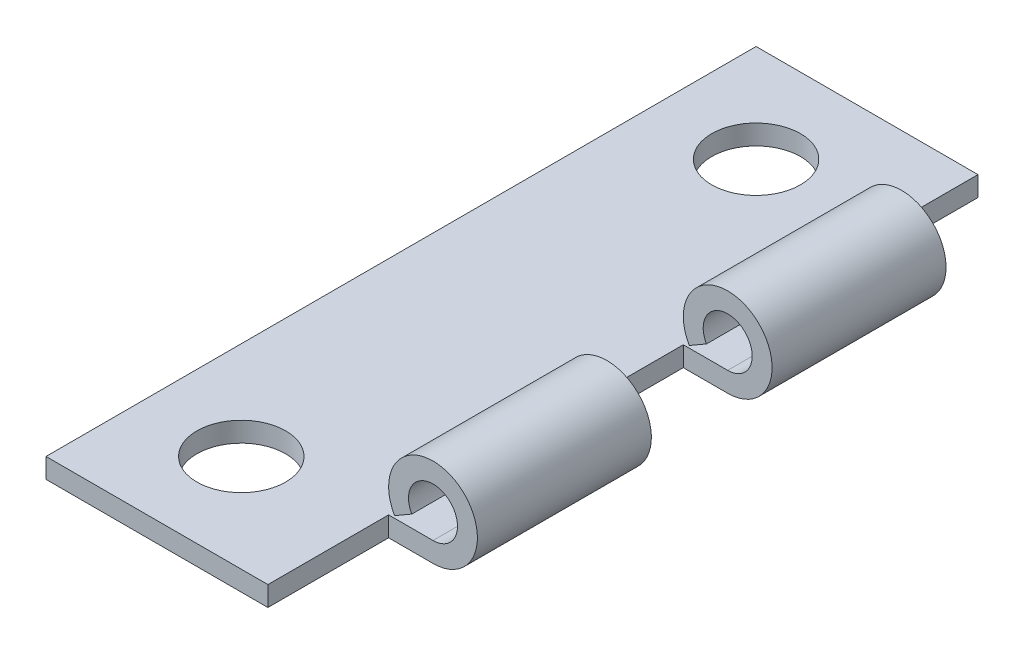
ISO-10303-21;
HEADER;
FILE_DESCRIPTION(('STEP AP214'),'2;1');
FILE_NAME('part.step','',(''),(''),'','','');
FILE_SCHEMA(('AUTOMOTIVE_DESIGN { 1 0 10303 214 1 1 1 1 }'));
ENDSEC;
DATA;
#1=APPLICATION_CONTEXT('core data for automotive mechanical design processes');
#2=APPLICATION_PROTOCOL_DEFINITION('international standard','automotive_design',2000,#1);
#3=PRODUCT_CONTEXT('',#1,'mechanical');
#4=PRODUCT('Part','Part','',(#3));
#5=PRODUCT_RELATED_PRODUCT_CATEGORY('part','',(#4));
#6=PRODUCT_DEFINITION_FORMATION('','',#4);
#7=PRODUCT_DEFINITION_CONTEXT('part definition',#1,'design');
#8=PRODUCT_DEFINITION('design','',#6,#7);
#9=PRODUCT_DEFINITION_SHAPE('','',#8);
#10=(LENGTH_UNIT() NAMED_UNIT(*) SI_UNIT(.MILLI.,.METRE.));
#11=(NAMED_UNIT(*) PLANE_ANGLE_UNIT() SI_UNIT($,.RADIAN.));
#12=(NAMED_UNIT(*) SI_UNIT($,.STERADIAN.) SOLID_ANGLE_UNIT());
#13=UNCERTAINTY_MEASURE_WITH_UNIT(LENGTH_MEASURE(1.E-05),#10,'distance_accuracy_value','');
#14=(GEOMETRIC_REPRESENTATION_CONTEXT(3) GLOBAL_UNCERTAINTY_ASSIGNED_CONTEXT((#13)) GLOBAL_UNIT_ASSIGNED_CONTEXT((#10,
#11,#12)) REPRESENTATION_CONTEXT('',''));
#15=CARTESIAN_POINT('',(0.,0.,0.));
#16=DIRECTION('',(0.,0.,1.));
#17=DIRECTION('',(1.,0.,0.));
#18=AXIS2_PLACEMENT_3D('',#15,#16,#17);
#19=CARTESIAN_POINT('',(19.05,3.175,50.8));
#20=DIRECTION('',(0.,0.,-1.));
#21=DIRECTION('',(-1.,0.,0.));
#22=AXIS2_PLACEMENT_3D('',#19,#20,#21);
#23=CYLINDRICAL_SURFACE('',#22,3.175);
#24=CARTESIAN_POINT('',(19.05,3.175,8.636));
#25=DIRECTION('',(0.,0.,1.));
#26=DIRECTION('',(1.,0.,0.));
#27=AXIS2_PLACEMENT_3D('',#24,#25,#26);
#28=CIRCLE('',#27,3.175);
#29=CARTESIAN_POINT('',(19.05,0.,8.636));
#30=VERTEX_POINT('',#29);
#31=CARTESIAN_POINT('',(16.3003693429844,1.58750000000001,8.636));
#32=VERTEX_POINT('',#31);
#33=EDGE_CURVE('E159',#30,#32,#28,.T.);
#34=ORIENTED_EDGE('',*,*,#33,.T.);
#35=DIRECTION('',(0.,0.,-1.));
#36=VECTOR('',#35,1.);
#37=CARTESIAN_POINT('',(16.3003693429844,1.5875,50.8));
#38=LINE('',#37,#36);
#39=CARTESIAN_POINT('',(16.3003693429844,1.5875,21.082));
#40=VERTEX_POINT('',#39);
#41=EDGE_CURVE('E257',#40,#32,#38,.T.);
#42=ORIENTED_EDGE('',*,*,#41,.F.);
#43=CARTESIAN_POINT('',(19.05,3.175,21.082));
#44=DIRECTION('',(0.,0.,-1.));
#45=DIRECTION('',(-1.,0.,0.));
#46=AXIS2_PLACEMENT_3D('',#43,#44,#45);
#47=CIRCLE('',#46,3.175);
#48=CARTESIAN_POINT('',(19.05,0.,21.082));
#49=VERTEX_POINT('',#48);
#50=EDGE_CURVE('E203',#40,#49,#47,.T.);
#51=ORIENTED_EDGE('',*,*,#50,.T.);
#52=DIRECTION('',(0.,0.,-1.));
#53=VECTOR('',#52,1.);
#54=CARTESIAN_POINT('',(19.05,0.,50.8));
#55=LINE('',#54,#53);
#56=EDGE_CURVE('E261',#49,#30,#55,.T.);
#57=ORIENTED_EDGE('',*,*,#56,.T.);
#58=EDGE_LOOP('',(#34,#42,#51,#57));
#59=FACE_BOUND('',#58,.T.);
#60=ADVANCED_FACE('F37',(#59),#23,.T.);
#61=CARTESIAN_POINT('',(16.3003693429844,1.5875,50.8));
#62=DIRECTION('',(-0.499999999999978,0.866025403784451,0.));
#63=DIRECTION('',(-0.866025403784451,-0.499999999999978,0.));
#64=AXIS2_PLACEMENT_3D('',#61,#62,#63);
#65=PLANE('',#64);
#66=ORIENTED_EDGE('',*,*,#41,.T.);
#67=DIRECTION('',(0.866025403784451,0.499999999999978,0.));
#68=VECTOR('',#67,1.);
#69=CARTESIAN_POINT('',(16.3003693429844,1.58750000000001,8.636));
#70=LINE('',#69,#68);
#71=CARTESIAN_POINT('',(17.5322038773275,2.2987,8.636));
#72=VERTEX_POINT('',#71);
#73=EDGE_CURVE('E174',#32,#72,#70,.T.);
#74=ORIENTED_EDGE('',*,*,#73,.T.);
#75=DIRECTION('',(0.,0.,-1.));
#76=VECTOR('',#75,1.);
#77=CARTESIAN_POINT('',(17.5322038773275,2.2987,50.8));
#78=LINE('',#77,#76);
#79=CARTESIAN_POINT('',(17.5322038773275,2.2987,21.082));
#80=VERTEX_POINT('',#79);
#81=EDGE_CURVE('E253',#80,#72,#78,.T.);
#82=ORIENTED_EDGE('',*,*,#81,.F.);
#83=DIRECTION('',(-0.866025403784451,-0.499999999999978,0.));
#84=VECTOR('',#83,1.);
#85=CARTESIAN_POINT('',(16.3003693429844,1.58750000000001,21.082));
#86=LINE('',#85,#84);
#87=EDGE_CURVE('E200',#80,#40,#86,.T.);
#88=ORIENTED_EDGE('',*,*,#87,.T.);
#89=EDGE_LOOP('',(#66,#74,#82,#88));
#90=FACE_BOUND('',#89,.T.);
#91=ADVANCED_FACE('F299',(#90),#65,.F.);
#92=CARTESIAN_POINT('',(19.0500000000001,3.175,50.8));
#93=DIRECTION('',(0.,0.,-1.));
#94=DIRECTION('',(-1.,0.,0.));
#95=AXIS2_PLACEMENT_3D('',#92,#93,#94);
#96=CYLINDRICAL_SURFACE('',#95,1.7526);
#97=ORIENTED_EDGE('',*,*,#81,.T.);
#98=CARTESIAN_POINT('',(19.0500000000001,3.175,8.636));
#99=DIRECTION('',(0.,0.,1.));
#100=DIRECTION('',(1.,0.,0.));
#101=AXIS2_PLACEMENT_3D('',#98,#99,#100);
#102=CIRCLE('',#101,1.7526);
#103=CARTESIAN_POINT('',(19.0500000000001,1.4224,8.636));
#104=VERTEX_POINT('',#103);
#105=EDGE_CURVE('E171',#72,#104,#102,.F.);
#106=ORIENTED_EDGE('',*,*,#105,.T.);
#107=DIRECTION('',(0.,0.,-1.));
#108=VECTOR('',#107,1.);
#109=CARTESIAN_POINT('',(19.0500000000001,1.4224,50.8));
#110=LINE('',#109,#108);
#111=CARTESIAN_POINT('',(19.0500000000001,1.4224,21.082));
#112=VERTEX_POINT('',#111);
#113=EDGE_CURVE('E249',#112,#104,#110,.T.);
#114=ORIENTED_EDGE('',*,*,#113,.F.);
#115=CARTESIAN_POINT('',(19.0500000000001,3.175,21.082));
#116=DIRECTION('',(0.,0.,-1.));
#117=DIRECTION('',(-1.,0.,0.));
#118=AXIS2_PLACEMENT_3D('',#115,#116,#117);
#119=CIRCLE('',#118,1.7526);
#120=EDGE_CURVE('E197',#112,#80,#119,.F.);
#121=ORIENTED_EDGE('',*,*,#120,.T.);
#122=EDGE_LOOP('',(#97,#106,#114,#121));
#123=FACE_BOUND('',#122,.T.);
#124=ADVANCED_FACE('F295',(#123),#96,.F.);
#125=CARTESIAN_POINT('',(19.05,3.175,29.718));
#126=DIRECTION('',(0.,0.,1.));
#127=DIRECTION('',(1.,0.,0.));
#128=AXIS2_PLACEMENT_3D('',#125,#126,#127);
#129=CIRCLE('',#128,3.175);
#130=CARTESIAN_POINT('',(19.05,0.,29.718));
#131=VERTEX_POINT('',#130);
#132=CARTESIAN_POINT('',(16.3003693429844,1.5875,29.718));
#133=VERTEX_POINT('',#132);
#134=EDGE_CURVE('E195',#131,#133,#129,.T.);
#135=ORIENTED_EDGE('',*,*,#134,.T.);
#136=CARTESIAN_POINT('',(16.3003693429844,1.5875,42.164));
#137=VERTEX_POINT('',#136);
#138=EDGE_CURVE('E258',#137,#133,#38,.T.);
#139=ORIENTED_EDGE('',*,*,#138,.F.);
#140=CARTESIAN_POINT('',(19.05,3.175,42.164));
#141=DIRECTION('',(0.,0.,-1.));
#142=DIRECTION('',(-1.,0.,0.));
#143=AXIS2_PLACEMENT_3D('',#140,#141,#142);
#144=CIRCLE('',#143,3.175);
#145=CARTESIAN_POINT('',(19.05,0.,42.164));
#146=VERTEX_POINT('',#145);
#147=EDGE_CURVE('E222',#137,#146,#144,.T.);
#148=ORIENTED_EDGE('',*,*,#147,.T.);
#149=EDGE_CURVE('E262',#146,#131,#55,.T.);
#150=ORIENTED_EDGE('',*,*,#149,.T.);
#151=EDGE_LOOP('',(#135,#139,#148,#150));
#152=FACE_BOUND('',#151,.T.);
#153=ADVANCED_FACE('F315',(#152),#23,.T.);
#154=CARTESIAN_POINT('',(0.,1.42239999999999,50.8));
#155=DIRECTION('',(1.,0.,0.));
#156=DIRECTION('',(0.,1.,0.));
#157=AXIS2_PLACEMENT_3D('',#154,#155,#156);
#158=PLANE('',#157);
#159=DIRECTION('',(0.,-1.,0.));
#160=VECTOR('',#159,1.);
#161=CARTESIAN_POINT('',(0.,1.42239999999999,0.));
#162=LINE('',#161,#160);
#163=CARTESIAN_POINT('',(0.,1.42239999999999,0.));
#164=VERTEX_POINT('',#163);
#165=CARTESIAN_POINT('',(0.,0.,0.));
#166=VERTEX_POINT('',#165);
#167=EDGE_CURVE('E242',#164,#166,#162,.T.);
#168=ORIENTED_EDGE('',*,*,#167,.T.);
#169=DIRECTION('',(0.,0.,-1.));
#170=VECTOR('',#169,1.);
#171=CARTESIAN_POINT('',(0.,0.,50.8));
#172=LINE('',#171,#170);
#173=CARTESIAN_POINT('',(0.,0.,50.8));
#174=VERTEX_POINT('',#173);
#175=EDGE_CURVE('E265',#174,#166,#172,.T.);
#176=ORIENTED_EDGE('',*,*,#175,.F.);
#177=DIRECTION('',(0.,-1.,0.));
#178=VECTOR('',#177,1.);
#179=CARTESIAN_POINT('',(0.,1.42239999999999,50.8));
#180=LINE('',#179,#178);
#181=CARTESIAN_POINT('',(0.,1.42239999999999,50.8));
#182=VERTEX_POINT('',#181);
#183=EDGE_CURVE('E232',#182,#174,#180,.T.);
#184=ORIENTED_EDGE('',*,*,#183,.F.);
#185=DIRECTION('',(0.,0.,-1.));
#186=VECTOR('',#185,1.);
#187=CARTESIAN_POINT('',(0.,1.42239999999999,50.8));
#188=LINE('',#187,#186);
#189=EDGE_CURVE('E241',#182,#164,#188,.T.);
#190=ORIENTED_EDGE('',*,*,#189,.T.);
#191=EDGE_LOOP('',(#168,#176,#184,#190));
#192=FACE_BOUND('',#191,.T.);
#193=ADVANCED_FACE('F39',(#192),#158,.F.);
#194=CARTESIAN_POINT('',(0.,0.,50.8));
#195=DIRECTION('',(0.,1.,0.));
#196=DIRECTION('',(0.,0.,1.));
#197=AXIS2_PLACEMENT_3D('',#194,#195,#196);
#198=PLANE('',#197);
#199=CARTESIAN_POINT('',(6.985,0.,6.985));
#200=DIRECTION('',(0.,-1.,0.));
#201=DIRECTION('',(0.,0.,-1.));
#202=AXIS2_PLACEMENT_3D('',#199,#200,#201);
#203=CIRCLE('',#202,3.175);
#204=CARTESIAN_POINT('',(6.985,0.,3.81));
#205=VERTEX_POINT('',#204);
#206=EDGE_CURVE('E224',#205,#205,#203,.T.);
#207=ORIENTED_EDGE('',*,*,#206,.F.);
#208=EDGE_LOOP('',(#207));
#209=FACE_BOUND('',#208,.T.);
#210=CARTESIAN_POINT('',(6.985,0.,43.815));
#211=DIRECTION('',(0.,-1.,0.));
#212=DIRECTION('',(0.,0.,-1.));
#213=AXIS2_PLACEMENT_3D('',#210,#211,#212);
#214=CIRCLE('',#213,3.175);
#215=CARTESIAN_POINT('',(6.985,0.,40.64));
#216=VERTEX_POINT('',#215);
#217=EDGE_CURVE('E228',#216,#216,#214,.T.);
#218=ORIENTED_EDGE('',*,*,#217,.F.);
#219=EDGE_LOOP('',(#218));
#220=FACE_BOUND('',#219,.T.);
#221=DIRECTION('',(1.,0.,0.));
#222=VECTOR('',#221,1.);
#223=CARTESIAN_POINT('',(0.,0.,0.));
#224=LINE('',#223,#222);
#225=CARTESIAN_POINT('',(15.875,0.,0.));
#226=VERTEX_POINT('',#225);
#227=EDGE_CURVE('E167',#166,#226,#224,.T.);
#228=ORIENTED_EDGE('',*,*,#227,.T.);
#229=DIRECTION('',(0.,0.,-1.));
#230=VECTOR('',#229,1.);
#231=CARTESIAN_POINT('',(15.875,0.,8.636));
#232=LINE('',#231,#230);
#233=CARTESIAN_POINT('',(15.875,0.,8.636));
#234=VERTEX_POINT('',#233);
#235=EDGE_CURVE('E52',#234,#226,#232,.T.);
#236=ORIENTED_EDGE('',*,*,#235,.F.);
#237=DIRECTION('',(-1.,0.,0.));
#238=VECTOR('',#237,1.);
#239=CARTESIAN_POINT('',(22.225,0.,8.636));
#240=LINE('',#239,#238);
#241=EDGE_CURVE('E156',#30,#234,#240,.T.);
#242=ORIENTED_EDGE('',*,*,#241,.F.);
#243=ORIENTED_EDGE('',*,*,#56,.F.);
#244=DIRECTION('',(1.,0.,0.));
#245=VECTOR('',#244,1.);
#246=CARTESIAN_POINT('',(22.225,0.,21.082));
#247=LINE('',#246,#245);
#248=CARTESIAN_POINT('',(15.875,0.,21.082));
#249=VERTEX_POINT('',#248);
#250=EDGE_CURVE('E183',#249,#49,#247,.T.);
#251=ORIENTED_EDGE('',*,*,#250,.F.);
#252=DIRECTION('',(0.,0.,-1.));
#253=VECTOR('',#252,1.);
#254=CARTESIAN_POINT('',(15.875,0.,29.718));
#255=LINE('',#254,#253);
#256=CARTESIAN_POINT('',(15.875,0.,29.718));
#257=VERTEX_POINT('',#256);
#258=EDGE_CURVE('E180',#257,#249,#255,.T.);
#259=ORIENTED_EDGE('',*,*,#258,.F.);
#260=DIRECTION('',(-1.,0.,0.));
#261=VECTOR('',#260,1.);
#262=CARTESIAN_POINT('',(22.225,0.,29.718));
#263=LINE('',#262,#261);
#264=EDGE_CURVE('E178',#131,#257,#263,.T.);
#265=ORIENTED_EDGE('',*,*,#264,.F.);
#266=ORIENTED_EDGE('',*,*,#149,.F.);
#267=DIRECTION('',(1.,0.,0.));
#268=VECTOR('',#267,1.);
#269=CARTESIAN_POINT('',(15.875,0.,42.164));
#270=LINE('',#269,#268);
#271=CARTESIAN_POINT('',(15.875,0.,42.164));
#272=VERTEX_POINT('',#271);
#273=EDGE_CURVE('E208',#272,#146,#270,.T.);
#274=ORIENTED_EDGE('',*,*,#273,.F.);
#275=DIRECTION('',(0.,0.,-1.));
#276=VECTOR('',#275,1.);
#277=CARTESIAN_POINT('',(15.875,0.,50.8));
#278=LINE('',#277,#276);
#279=CARTESIAN_POINT('',(15.875,0.,50.8));
#280=VERTEX_POINT('',#279);
#281=EDGE_CURVE('E205',#280,#272,#278,.T.);
#282=ORIENTED_EDGE('',*,*,#281,.F.);
#283=DIRECTION('',(1.,0.,0.));
#284=VECTOR('',#283,1.);
#285=CARTESIAN_POINT('',(0.,0.,50.8));
#286=LINE('',#285,#284);
#287=EDGE_CURVE('E235',#174,#280,#286,.T.);
#288=ORIENTED_EDGE('',*,*,#287,.F.);
#289=ORIENTED_EDGE('',*,*,#175,.T.);
#290=EDGE_LOOP('',(#228,#236,#242,#243,#251,#259,#265,#266,#274,#282,#288,#289));
#291=FACE_BOUND('',#290,.T.);
#292=ADVANCED_FACE('F165',(#209,#220,#291),#198,.F.);
#293=ORIENTED_EDGE('',*,*,#138,.T.);
#294=DIRECTION('',(0.866025403784451,0.499999999999978,0.));
#295=VECTOR('',#294,1.);
#296=CARTESIAN_POINT('',(16.3003693429844,1.5875,29.718));
#297=LINE('',#296,#295);
#298=CARTESIAN_POINT('',(17.5322038773275,2.2987,29.718));
#299=VERTEX_POINT('',#298);
#300=EDGE_CURVE('E192',#133,#299,#297,.T.);
#301=ORIENTED_EDGE('',*,*,#300,.T.);
#302=CARTESIAN_POINT('',(17.5322038773275,2.2987,42.164));
#303=VERTEX_POINT('',#302);
#304=EDGE_CURVE('E254',#303,#299,#78,.T.);
#305=ORIENTED_EDGE('',*,*,#304,.F.);
#306=DIRECTION('',(-0.866025403784451,-0.499999999999978,0.));
#307=VECTOR('',#306,1.);
#308=CARTESIAN_POINT('',(16.3003693429844,1.5875,42.164));
#309=LINE('',#308,#307);
#310=EDGE_CURVE('E219',#303,#137,#309,.T.);
#311=ORIENTED_EDGE('',*,*,#310,.T.);
#312=EDGE_LOOP('',(#293,#301,#305,#311));
#313=FACE_BOUND('',#312,.T.);
#314=ADVANCED_FACE('F347',(#313),#65,.F.);
#315=ORIENTED_EDGE('',*,*,#304,.T.);
#316=CARTESIAN_POINT('',(19.0500000000001,3.175,29.718));
#317=DIRECTION('',(0.,0.,1.));
#318=DIRECTION('',(1.,0.,0.));
#319=AXIS2_PLACEMENT_3D('',#316,#317,#318);
#320=CIRCLE('',#319,1.7526);
#321=CARTESIAN_POINT('',(19.0500000000001,1.4224,29.718));
#322=VERTEX_POINT('',#321);
#323=EDGE_CURVE('E188',#299,#322,#320,.F.);
#324=ORIENTED_EDGE('',*,*,#323,.T.);
#325=CARTESIAN_POINT('',(19.0500000000001,1.4224,42.164));
#326=VERTEX_POINT('',#325);
#327=EDGE_CURVE('E250',#326,#322,#110,.T.);
#328=ORIENTED_EDGE('',*,*,#327,.F.);
#329=CARTESIAN_POINT('',(19.0500000000001,3.175,42.164));
#330=DIRECTION('',(0.,0.,-1.));
#331=DIRECTION('',(-1.,0.,0.));
#332=AXIS2_PLACEMENT_3D('',#329,#330,#331);
#333=CIRCLE('',#332,1.7526);
#334=EDGE_CURVE('E216',#326,#303,#333,.F.);
#335=ORIENTED_EDGE('',*,*,#334,.T.);
#336=EDGE_LOOP('',(#315,#324,#328,#335));
#337=FACE_BOUND('',#336,.T.);
#338=ADVANCED_FACE('F354',(#337),#96,.F.);
#339=CARTESIAN_POINT('',(19.0500000000001,1.4224,50.8));
#340=DIRECTION('',(0.,-1.,0.));
#341=DIRECTION('',(1.,0.,0.));
#342=AXIS2_PLACEMENT_3D('',#339,#340,#341);
#343=PLANE('',#342);
#344=CARTESIAN_POINT('',(6.985,1.42239999999999,6.985));
#345=DIRECTION('',(0.,-1.,0.));
#346=DIRECTION('',(1.,0.,0.));
#347=AXIS2_PLACEMENT_3D('',#344,#345,#346);
#348=CIRCLE('',#347,3.175);
#349=CARTESIAN_POINT('',(10.16,1.4224,6.985));
#350=VERTEX_POINT('',#349);
#351=EDGE_CURVE('E227',#350,#350,#348,.T.);
#352=ORIENTED_EDGE('',*,*,#351,.T.);
#353=EDGE_LOOP('',(#352));
#354=FACE_BOUND('',#353,.T.);
#355=CARTESIAN_POINT('',(6.985,1.42239999999999,43.815));
#356=DIRECTION('',(0.,-1.,0.));
#357=DIRECTION('',(1.,0.,0.));
#358=AXIS2_PLACEMENT_3D('',#355,#356,#357);
#359=CIRCLE('',#358,3.175);
#360=CARTESIAN_POINT('',(10.16,1.4224,43.815));
#361=VERTEX_POINT('',#360);
#362=EDGE_CURVE('E231',#361,#361,#359,.T.);
#363=ORIENTED_EDGE('',*,*,#362,.T.);
#364=EDGE_LOOP('',(#363));
#365=FACE_BOUND('',#364,.T.);
#366=DIRECTION('',(-1.,0.,0.));
#367=VECTOR('',#366,1.);
#368=CARTESIAN_POINT('',(19.0500000000001,1.4224,8.636));
#369=LINE('',#368,#367);
#370=CARTESIAN_POINT('',(15.875,1.4224,8.636));
#371=VERTEX_POINT('',#370);
#372=EDGE_CURVE('E11',#104,#371,#369,.T.);
#373=ORIENTED_EDGE('',*,*,#372,.T.);
#374=DIRECTION('',(0.,0.,-1.));
#375=VECTOR('',#374,1.);
#376=CARTESIAN_POINT('',(15.875,1.4224,50.8));
#377=LINE('',#376,#375);
#378=CARTESIAN_POINT('',(15.875,1.4224,0.));
#379=VERTEX_POINT('',#378);
#380=EDGE_CURVE('E152',#371,#379,#377,.T.);
#381=ORIENTED_EDGE('',*,*,#380,.T.);
#382=DIRECTION('',(-1.,0.,0.));
#383=VECTOR('',#382,1.);
#384=CARTESIAN_POINT('',(19.0500000000001,1.4224,0.));
#385=LINE('',#384,#383);
#386=EDGE_CURVE('E236',#379,#164,#385,.T.);
#387=ORIENTED_EDGE('',*,*,#386,.T.);
#388=ORIENTED_EDGE('',*,*,#189,.F.);
#389=DIRECTION('',(-1.,0.,0.));
#390=VECTOR('',#389,1.);
#391=CARTESIAN_POINT('',(19.0500000000001,1.4224,50.8));
#392=LINE('',#391,#390);
#393=CARTESIAN_POINT('',(15.875,1.4224,50.8));
#394=VERTEX_POINT('',#393);
#395=EDGE_CURVE('E239',#394,#182,#392,.T.);
#396=ORIENTED_EDGE('',*,*,#395,.F.);
#397=DIRECTION('',(0.,0.,-1.));
#398=VECTOR('',#397,1.);
#399=CARTESIAN_POINT('',(15.875,1.4224,50.8));
#400=LINE('',#399,#398);
#401=CARTESIAN_POINT('',(15.875,1.4224,42.164));
#402=VERTEX_POINT('',#401);
#403=EDGE_CURVE('E213',#394,#402,#400,.T.);
#404=ORIENTED_EDGE('',*,*,#403,.T.);
#405=DIRECTION('',(1.,0.,0.));
#406=VECTOR('',#405,1.);
#407=CARTESIAN_POINT('',(19.0500000000001,1.4224,42.164));
#408=LINE('',#407,#406);
#409=EDGE_CURVE('E273',#402,#326,#408,.T.);
#410=ORIENTED_EDGE('',*,*,#409,.T.);
#411=ORIENTED_EDGE('',*,*,#327,.T.);
#412=DIRECTION('',(-1.,0.,0.));
#413=VECTOR('',#412,1.);
#414=CARTESIAN_POINT('',(19.0500000000001,1.4224,29.718));
#415=LINE('',#414,#413);
#416=CARTESIAN_POINT('',(15.875,1.4224,29.718));
#417=VERTEX_POINT('',#416);
#418=EDGE_CURVE('E276',#322,#417,#415,.T.);
#419=ORIENTED_EDGE('',*,*,#418,.T.);
#420=DIRECTION('',(0.,0.,-1.));
#421=VECTOR('',#420,1.);
#422=CARTESIAN_POINT('',(15.875,1.4224,50.8));
#423=LINE('',#422,#421);
#424=CARTESIAN_POINT('',(15.875,1.42239999999999,21.082));
#425=VERTEX_POINT('',#424);
#426=EDGE_CURVE('E279',#417,#425,#423,.T.);
#427=ORIENTED_EDGE('',*,*,#426,.T.);
#428=DIRECTION('',(1.,0.,0.));
#429=VECTOR('',#428,1.);
#430=CARTESIAN_POINT('',(19.0500000000001,1.4224,21.082));
#431=LINE('',#430,#429);
#432=EDGE_CURVE('E282',#425,#112,#431,.T.);
#433=ORIENTED_EDGE('',*,*,#432,.T.);
#434=ORIENTED_EDGE('',*,*,#113,.T.);
#435=EDGE_LOOP('',(#373,#381,#387,#388,#396,#404,#410,#411,#419,#427,#433,#434));
#436=FACE_BOUND('',#435,.T.);
#437=ADVANCED_FACE('F289',(#354,#365,#436),#343,.F.);
#438=CARTESIAN_POINT('',(19.05,3.175,50.8));
#439=DIRECTION('',(0.,0.,1.));
#440=DIRECTION('',(1.,0.,0.));
#441=AXIS2_PLACEMENT_3D('',#438,#439,#440);
#442=PLANE('',#441);
#443=DIRECTION('',(0.,-1.,0.));
#444=VECTOR('',#443,1.);
#445=CARTESIAN_POINT('',(15.875,3.175,50.8));
#446=LINE('',#445,#444);
#447=EDGE_CURVE('E267',#394,#280,#446,.T.);
#448=ORIENTED_EDGE('',*,*,#447,.F.);
#449=ORIENTED_EDGE('',*,*,#395,.T.);
#450=ORIENTED_EDGE('',*,*,#183,.T.);
#451=ORIENTED_EDGE('',*,*,#287,.T.);
#452=EDGE_LOOP('',(#448,#449,#450,#451));
#453=FACE_BOUND('',#452,.T.);
#454=ADVANCED_FACE('F324',(#453),#442,.T.);
#455=CARTESIAN_POINT('',(19.05,3.175,0.));
#456=DIRECTION('',(0.,0.,1.));
#457=DIRECTION('',(1.,0.,0.));
#458=AXIS2_PLACEMENT_3D('',#455,#456,#457);
#459=PLANE('',#458);
#460=ORIENTED_EDGE('',*,*,#386,.F.);
#461=DIRECTION('',(0.,-1.,0.));
#462=VECTOR('',#461,1.);
#463=CARTESIAN_POINT('',(15.875,3.175,0.));
#464=LINE('',#463,#462);
#465=EDGE_CURVE('E45',#379,#226,#464,.T.);
#466=ORIENTED_EDGE('',*,*,#465,.T.);
#467=ORIENTED_EDGE('',*,*,#227,.F.);
#468=ORIENTED_EDGE('',*,*,#167,.F.);
#469=EDGE_LOOP('',(#460,#466,#467,#468));
#470=FACE_BOUND('',#469,.T.);
#471=ADVANCED_FACE('F286',(#470),#459,.F.);
#472=CARTESIAN_POINT('',(6.985,6.35,43.815));
#473=DIRECTION('',(0.,-1.,0.));
#474=DIRECTION('',(0.,0.,-1.));
#475=AXIS2_PLACEMENT_3D('',#472,#473,#474);
#476=CYLINDRICAL_SURFACE('',#475,3.175);
#477=ORIENTED_EDGE('',*,*,#217,.T.);
#478=EDGE_LOOP('',(#477));
#479=FACE_BOUND('',#478,.T.);
#480=ORIENTED_EDGE('',*,*,#362,.F.);
#481=EDGE_LOOP('',(#480));
#482=FACE_BOUND('',#481,.T.);
#483=ADVANCED_FACE('F377',(#479,#482),#476,.F.);
#484=CARTESIAN_POINT('',(6.985,6.35,6.985));
#485=DIRECTION('',(0.,-1.,0.));
#486=DIRECTION('',(0.,0.,-1.));
#487=AXIS2_PLACEMENT_3D('',#484,#485,#486);
#488=CYLINDRICAL_SURFACE('',#487,3.175);
#489=ORIENTED_EDGE('',*,*,#206,.T.);
#490=EDGE_LOOP('',(#489));
#491=FACE_BOUND('',#490,.T.);
#492=ORIENTED_EDGE('',*,*,#351,.F.);
#493=EDGE_LOOP('',(#492));
#494=FACE_BOUND('',#493,.T.);
#495=ADVANCED_FACE('F338',(#491,#494),#488,.F.);
#496=CARTESIAN_POINT('',(15.875,6.35,42.164));
#497=DIRECTION('',(0.,0.,-1.));
#498=DIRECTION('',(-1.,0.,0.));
#499=AXIS2_PLACEMENT_3D('',#496,#497,#498);
#500=PLANE('',#499);
#501=ORIENTED_EDGE('',*,*,#147,.F.);
#502=ORIENTED_EDGE('',*,*,#310,.F.);
#503=ORIENTED_EDGE('',*,*,#334,.F.);
#504=ORIENTED_EDGE('',*,*,#409,.F.);
#505=DIRECTION('',(0.,-1.,0.));
#506=VECTOR('',#505,1.);
#507=CARTESIAN_POINT('',(15.875,6.35,42.164));
#508=LINE('',#507,#506);
#509=EDGE_CURVE('E211',#402,#272,#508,.T.);
#510=ORIENTED_EDGE('',*,*,#509,.T.);
#511=ORIENTED_EDGE('',*,*,#273,.T.);
#512=EDGE_LOOP('',(#501,#502,#503,#504,#510,#511));
#513=FACE_BOUND('',#512,.T.);
#514=ADVANCED_FACE('F318',(#513),#500,.F.);
#515=CARTESIAN_POINT('',(15.875,6.35,50.8));
#516=DIRECTION('',(-1.,0.,0.));
#517=DIRECTION('',(0.,0.,1.));
#518=AXIS2_PLACEMENT_3D('',#515,#516,#517);
#519=PLANE('',#518);
#520=ORIENTED_EDGE('',*,*,#447,.T.);
#521=ORIENTED_EDGE('',*,*,#281,.T.);
#522=ORIENTED_EDGE('',*,*,#509,.F.);
#523=ORIENTED_EDGE('',*,*,#403,.F.);
#524=EDGE_LOOP('',(#520,#521,#522,#523));
#525=FACE_BOUND('',#524,.T.);
#526=ADVANCED_FACE('F330',(#525),#519,.F.);
#527=CARTESIAN_POINT('',(22.225,6.35,21.082));
#528=DIRECTION('',(0.,0.,-1.));
#529=DIRECTION('',(-1.,0.,0.));
#530=AXIS2_PLACEMENT_3D('',#527,#528,#529);
#531=PLANE('',#530);
#532=ORIENTED_EDGE('',*,*,#50,.F.);
#533=ORIENTED_EDGE('',*,*,#87,.F.);
#534=ORIENTED_EDGE('',*,*,#120,.F.);
#535=ORIENTED_EDGE('',*,*,#432,.F.);
#536=DIRECTION('',(0.,-1.,0.));
#537=VECTOR('',#536,1.);
#538=CARTESIAN_POINT('',(15.875,6.35,21.082));
#539=LINE('',#538,#537);
#540=EDGE_CURVE('E186',#425,#249,#539,.T.);
#541=ORIENTED_EDGE('',*,*,#540,.T.);
#542=ORIENTED_EDGE('',*,*,#250,.T.);
#543=EDGE_LOOP('',(#532,#533,#534,#535,#541,#542));
#544=FACE_BOUND('',#543,.T.);
#545=ADVANCED_FACE('F306',(#544),#531,.F.);
#546=CARTESIAN_POINT('',(15.875,6.35,29.718));
#547=DIRECTION('',(-1.,0.,0.));
#548=DIRECTION('',(0.,0.,1.));
#549=AXIS2_PLACEMENT_3D('',#546,#547,#548);
#550=PLANE('',#549);
#551=DIRECTION('',(0.,-1.,0.));
#552=VECTOR('',#551,1.);
#553=CARTESIAN_POINT('',(15.875,6.35,29.718));
#554=LINE('',#553,#552);
#555=EDGE_CURVE('E60',#417,#257,#554,.T.);
#556=ORIENTED_EDGE('',*,*,#555,.T.);
#557=ORIENTED_EDGE('',*,*,#258,.T.);
#558=ORIENTED_EDGE('',*,*,#540,.F.);
#559=ORIENTED_EDGE('',*,*,#426,.F.);
#560=EDGE_LOOP('',(#556,#557,#558,#559));
#561=FACE_BOUND('',#560,.T.);
#562=ADVANCED_FACE('F309',(#561),#550,.F.);
#563=CARTESIAN_POINT('',(22.225,6.35,29.718));
#564=DIRECTION('',(0.,0.,1.));
#565=DIRECTION('',(1.,0.,0.));
#566=AXIS2_PLACEMENT_3D('',#563,#564,#565);
#567=PLANE('',#566);
#568=ORIENTED_EDGE('',*,*,#264,.T.);
#569=ORIENTED_EDGE('',*,*,#555,.F.);
#570=ORIENTED_EDGE('',*,*,#418,.F.);
#571=ORIENTED_EDGE('',*,*,#323,.F.);
#572=ORIENTED_EDGE('',*,*,#300,.F.);
#573=ORIENTED_EDGE('',*,*,#134,.F.);
#574=EDGE_LOOP('',(#568,#569,#570,#571,#572,#573));
#575=FACE_BOUND('',#574,.T.);
#576=ADVANCED_FACE('F310',(#575),#567,.F.);
#577=CARTESIAN_POINT('',(22.225,6.35,8.636));
#578=DIRECTION('',(0.,0.,1.));
#579=DIRECTION('',(1.,0.,0.));
#580=AXIS2_PLACEMENT_3D('',#577,#578,#579);
#581=PLANE('',#580);
#582=ORIENTED_EDGE('',*,*,#241,.T.);
#583=DIRECTION('',(0.,-1.,0.));
#584=VECTOR('',#583,1.);
#585=CARTESIAN_POINT('',(15.875,6.35,8.636));
#586=LINE('',#585,#584);
#587=EDGE_CURVE('E148',#371,#234,#586,.T.);
#588=ORIENTED_EDGE('',*,*,#587,.F.);
#589=ORIENTED_EDGE('',*,*,#372,.F.);
#590=ORIENTED_EDGE('',*,*,#105,.F.);
#591=ORIENTED_EDGE('',*,*,#73,.F.);
#592=ORIENTED_EDGE('',*,*,#33,.F.);
#593=EDGE_LOOP('',(#582,#588,#589,#590,#591,#592));
#594=FACE_BOUND('',#593,.T.);
#595=ADVANCED_FACE('F157',(#594),#581,.F.);
#596=CARTESIAN_POINT('',(15.875,6.35,8.636));
#597=DIRECTION('',(-1.,0.,0.));
#598=DIRECTION('',(0.,0.,1.));
#599=AXIS2_PLACEMENT_3D('',#596,#597,#598);
#600=PLANE('',#599);
#601=ORIENTED_EDGE('',*,*,#587,.T.);
#602=ORIENTED_EDGE('',*,*,#235,.T.);
#603=ORIENTED_EDGE('',*,*,#465,.F.);
#604=ORIENTED_EDGE('',*,*,#380,.F.);
#605=EDGE_LOOP('',(#601,#602,#603,#604));
#606=FACE_BOUND('',#605,.T.);
#607=ADVANCED_FACE('F150',(#606),#600,.F.);
#608=CLOSED_SHELL('',(#60,#91,#124,#153,#193,#292,#314,#338,#437,#454,#471,#483,#495,#514,#526,
#545,#562,#576,#595,#607));
#609=MANIFOLD_SOLID_BREP('B2',#608);
#610=ADVANCED_BREP_SHAPE_REPRESENTATION('',(#18,#609),#14);
#611=SHAPE_DEFINITION_REPRESENTATION(#9,#610);
ENDSEC;
END-ISO-10303-21;
